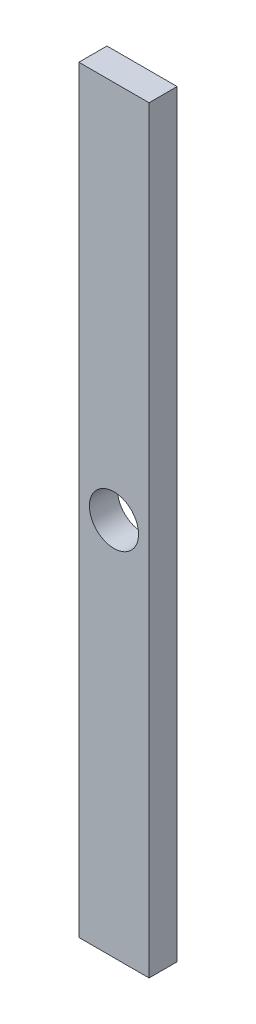
ISO-10303-21;
HEADER;
FILE_DESCRIPTION(('STEP AP214'),'2;1');
FILE_NAME('part.step','',(''),(''),'','','');
FILE_SCHEMA(('AUTOMOTIVE_DESIGN { 1 0 10303 214 1 1 1 1 }'));
ENDSEC;
DATA;
#1=APPLICATION_CONTEXT('core data for automotive mechanical design processes');
#2=APPLICATION_PROTOCOL_DEFINITION('international standard','automotive_design',2000,#1);
#3=PRODUCT_CONTEXT('',#1,'mechanical');
#4=PRODUCT('Part','Part','',(#3));
#5=PRODUCT_RELATED_PRODUCT_CATEGORY('part','',(#4));
#6=PRODUCT_DEFINITION_FORMATION('','',#4);
#7=PRODUCT_DEFINITION_CONTEXT('part definition',#1,'design');
#8=PRODUCT_DEFINITION('design','',#6,#7);
#9=PRODUCT_DEFINITION_SHAPE('','',#8);
#10=(LENGTH_UNIT() NAMED_UNIT(*) SI_UNIT(.MILLI.,.METRE.));
#11=(NAMED_UNIT(*) PLANE_ANGLE_UNIT() SI_UNIT($,.RADIAN.));
#12=(NAMED_UNIT(*) SI_UNIT($,.STERADIAN.) SOLID_ANGLE_UNIT());
#13=UNCERTAINTY_MEASURE_WITH_UNIT(LENGTH_MEASURE(1.E-05),#10,'distance_accuracy_value','');
#14=(GEOMETRIC_REPRESENTATION_CONTEXT(3) GLOBAL_UNCERTAINTY_ASSIGNED_CONTEXT((#13)) GLOBAL_UNIT_ASSIGNED_CONTEXT((#10,
#11,#12)) REPRESENTATION_CONTEXT('',''));
#15=CARTESIAN_POINT('',(0.,0.,0.));
#16=DIRECTION('',(0.,0.,1.));
#17=DIRECTION('',(1.,0.,0.));
#18=AXIS2_PLACEMENT_3D('',#15,#16,#17);
#19=CARTESIAN_POINT('',(2.5,27.,2.));
#20=DIRECTION('',(-1.,0.,0.));
#21=DIRECTION('',(0.,-1.,0.));
#22=AXIS2_PLACEMENT_3D('',#19,#20,#21);
#23=PLANE('',#22);
#24=DIRECTION('',(0.,1.,0.));
#25=VECTOR('',#24,1.);
#26=CARTESIAN_POINT('',(2.5,27.,0.));
#27=LINE('',#26,#25);
#28=CARTESIAN_POINT('',(2.5,-27.,0.));
#29=VERTEX_POINT('',#28);
#30=CARTESIAN_POINT('',(2.5,27.,0.));
#31=VERTEX_POINT('',#30);
#32=EDGE_CURVE('E98',#29,#31,#27,.T.);
#33=ORIENTED_EDGE('',*,*,#32,.T.);
#34=DIRECTION('',(0.,0.,-1.));
#35=VECTOR('',#34,1.);
#36=CARTESIAN_POINT('',(2.5,27.,2.));
#37=LINE('',#36,#35);
#38=CARTESIAN_POINT('',(2.5,27.,2.));
#39=VERTEX_POINT('',#38);
#40=EDGE_CURVE('E11',#39,#31,#37,.T.);
#41=ORIENTED_EDGE('',*,*,#40,.F.);
#42=DIRECTION('',(0.,1.,0.));
#43=VECTOR('',#42,1.);
#44=CARTESIAN_POINT('',(2.5,27.,2.));
#45=LINE('',#44,#43);
#46=CARTESIAN_POINT('',(2.5,-27.,2.));
#47=VERTEX_POINT('',#46);
#48=EDGE_CURVE('E85',#47,#39,#45,.T.);
#49=ORIENTED_EDGE('',*,*,#48,.F.);
#50=DIRECTION('',(0.,0.,-1.));
#51=VECTOR('',#50,1.);
#52=CARTESIAN_POINT('',(2.5,-27.,2.));
#53=LINE('',#52,#51);
#54=EDGE_CURVE('E94',#47,#29,#53,.T.);
#55=ORIENTED_EDGE('',*,*,#54,.T.);
#56=EDGE_LOOP('',(#33,#41,#49,#55));
#57=FACE_BOUND('',#56,.T.);
#58=ADVANCED_FACE('F33',(#57),#23,.F.);
#59=CARTESIAN_POINT('',(-2.5,27.,2.));
#60=DIRECTION('',(0.,-1.,0.));
#61=DIRECTION('',(0.,0.,-1.));
#62=AXIS2_PLACEMENT_3D('',#59,#60,#61);
#63=PLANE('',#62);
#64=DIRECTION('',(-1.,0.,0.));
#65=VECTOR('',#64,1.);
#66=CARTESIAN_POINT('',(-2.5,27.,0.));
#67=LINE('',#66,#65);
#68=CARTESIAN_POINT('',(-2.5,27.,0.));
#69=VERTEX_POINT('',#68);
#70=EDGE_CURVE('E89',#31,#69,#67,.T.);
#71=ORIENTED_EDGE('',*,*,#70,.T.);
#72=DIRECTION('',(0.,0.,-1.));
#73=VECTOR('',#72,1.);
#74=CARTESIAN_POINT('',(-2.5,27.,2.));
#75=LINE('',#74,#73);
#76=CARTESIAN_POINT('',(-2.5,27.,2.));
#77=VERTEX_POINT('',#76);
#78=EDGE_CURVE('E42',#77,#69,#75,.T.);
#79=ORIENTED_EDGE('',*,*,#78,.F.);
#80=DIRECTION('',(-1.,0.,0.));
#81=VECTOR('',#80,1.);
#82=CARTESIAN_POINT('',(-2.5,27.,2.));
#83=LINE('',#82,#81);
#84=EDGE_CURVE('E80',#39,#77,#83,.T.);
#85=ORIENTED_EDGE('',*,*,#84,.F.);
#86=ORIENTED_EDGE('',*,*,#40,.T.);
#87=EDGE_LOOP('',(#71,#79,#85,#86));
#88=FACE_BOUND('',#87,.T.);
#89=ADVANCED_FACE('F88',(#88),#63,.F.);
#90=CARTESIAN_POINT('',(-2.5,27.,2.));
#91=DIRECTION('',(1.,0.,0.));
#92=DIRECTION('',(0.,1.,0.));
#93=AXIS2_PLACEMENT_3D('',#90,#91,#92);
#94=PLANE('',#93);
#95=DIRECTION('',(0.,-1.,0.));
#96=VECTOR('',#95,1.);
#97=CARTESIAN_POINT('',(-2.5,27.,0.));
#98=LINE('',#97,#96);
#99=CARTESIAN_POINT('',(-2.5,-27.,0.));
#100=VERTEX_POINT('',#99);
#101=EDGE_CURVE('E67',#69,#100,#98,.T.);
#102=ORIENTED_EDGE('',*,*,#101,.T.);
#103=DIRECTION('',(0.,0.,-1.));
#104=VECTOR('',#103,1.);
#105=CARTESIAN_POINT('',(-2.5,-27.,2.));
#106=LINE('',#105,#104);
#107=CARTESIAN_POINT('',(-2.5,-27.,2.));
#108=VERTEX_POINT('',#107);
#109=EDGE_CURVE('E90',#108,#100,#106,.T.);
#110=ORIENTED_EDGE('',*,*,#109,.F.);
#111=DIRECTION('',(0.,-1.,0.));
#112=VECTOR('',#111,1.);
#113=CARTESIAN_POINT('',(-2.5,27.,2.));
#114=LINE('',#113,#112);
#115=EDGE_CURVE('E83',#77,#108,#114,.T.);
#116=ORIENTED_EDGE('',*,*,#115,.F.);
#117=ORIENTED_EDGE('',*,*,#78,.T.);
#118=EDGE_LOOP('',(#102,#110,#116,#117));
#119=FACE_BOUND('',#118,.T.);
#120=ADVANCED_FACE('F92',(#119),#94,.F.);
#121=CARTESIAN_POINT('',(-2.5,-27.,2.));
#122=DIRECTION('',(0.,1.,0.));
#123=DIRECTION('',(0.,0.,1.));
#124=AXIS2_PLACEMENT_3D('',#121,#122,#123);
#125=PLANE('',#124);
#126=DIRECTION('',(1.,0.,0.));
#127=VECTOR('',#126,1.);
#128=CARTESIAN_POINT('',(-2.5,-27.,0.));
#129=LINE('',#128,#127);
#130=EDGE_CURVE('E73',#100,#29,#129,.T.);
#131=ORIENTED_EDGE('',*,*,#130,.T.);
#132=ORIENTED_EDGE('',*,*,#54,.F.);
#133=DIRECTION('',(1.,0.,0.));
#134=VECTOR('',#133,1.);
#135=CARTESIAN_POINT('',(-2.5,-27.,2.));
#136=LINE('',#135,#134);
#137=EDGE_CURVE('E50',#108,#47,#136,.T.);
#138=ORIENTED_EDGE('',*,*,#137,.F.);
#139=ORIENTED_EDGE('',*,*,#109,.T.);
#140=EDGE_LOOP('',(#131,#132,#138,#139));
#141=FACE_BOUND('',#140,.T.);
#142=ADVANCED_FACE('F105',(#141),#125,.F.);
#143=CARTESIAN_POINT('',(0.,0.,2.));
#144=DIRECTION('',(0.,0.,1.));
#145=DIRECTION('',(1.,0.,0.));
#146=AXIS2_PLACEMENT_3D('',#143,#144,#145);
#147=PLANE('',#146);
#148=CARTESIAN_POINT('',(0.,0.,2.));
#149=DIRECTION('',(0.,0.,1.));
#150=DIRECTION('',(1.,0.,0.));
#151=AXIS2_PLACEMENT_3D('',#148,#149,#150);
#152=CIRCLE('',#151,1.75);
#153=CARTESIAN_POINT('',(1.75,0.,2.));
#154=VERTEX_POINT('',#153);
#155=EDGE_CURVE('E111',#154,#154,#152,.T.);
#156=ORIENTED_EDGE('',*,*,#155,.F.);
#157=EDGE_LOOP('',(#156));
#158=FACE_BOUND('',#157,.T.);
#159=ORIENTED_EDGE('',*,*,#48,.T.);
#160=ORIENTED_EDGE('',*,*,#84,.T.);
#161=ORIENTED_EDGE('',*,*,#115,.T.);
#162=ORIENTED_EDGE('',*,*,#137,.T.);
#163=EDGE_LOOP('',(#159,#160,#161,#162));
#164=FACE_BOUND('',#163,.T.);
#165=ADVANCED_FACE('F81',(#158,#164),#147,.T.);
#166=CARTESIAN_POINT('',(0.,0.,0.));
#167=DIRECTION('',(0.,0.,1.));
#168=DIRECTION('',(1.,0.,0.));
#169=AXIS2_PLACEMENT_3D('',#166,#167,#168);
#170=PLANE('',#169);
#171=CARTESIAN_POINT('',(0.,0.,0.));
#172=DIRECTION('',(0.,0.,1.));
#173=DIRECTION('',(1.,0.,0.));
#174=AXIS2_PLACEMENT_3D('',#171,#172,#173);
#175=CIRCLE('',#174,1.75);
#176=CARTESIAN_POINT('',(1.75,0.,0.));
#177=VERTEX_POINT('',#176);
#178=EDGE_CURVE('E36',#177,#177,#175,.T.);
#179=ORIENTED_EDGE('',*,*,#178,.T.);
#180=EDGE_LOOP('',(#179));
#181=FACE_BOUND('',#180,.T.);
#182=ORIENTED_EDGE('',*,*,#32,.F.);
#183=ORIENTED_EDGE('',*,*,#130,.F.);
#184=ORIENTED_EDGE('',*,*,#101,.F.);
#185=ORIENTED_EDGE('',*,*,#70,.F.);
#186=EDGE_LOOP('',(#182,#183,#184,#185));
#187=FACE_BOUND('',#186,.T.);
#188=ADVANCED_FACE('F108',(#181,#187),#170,.F.);
#189=CARTESIAN_POINT('',(0.,0.,-8.));
#190=DIRECTION('',(0.,0.,1.));
#191=DIRECTION('',(1.,0.,0.));
#192=AXIS2_PLACEMENT_3D('',#189,#190,#191);
#193=CYLINDRICAL_SURFACE('',#192,1.75);
#194=ORIENTED_EDGE('',*,*,#155,.T.);
#195=EDGE_LOOP('',(#194));
#196=FACE_BOUND('',#195,.T.);
#197=ORIENTED_EDGE('',*,*,#178,.F.);
#198=EDGE_LOOP('',(#197));
#199=FACE_BOUND('',#198,.T.);
#200=ADVANCED_FACE('F119',(#196,#199),#193,.F.);
#201=CLOSED_SHELL('',(#58,#89,#120,#142,#165,#188,#200));
#202=MANIFOLD_SOLID_BREP('B2',#201);
#203=ADVANCED_BREP_SHAPE_REPRESENTATION('',(#18,#202),#14);
#204=SHAPE_DEFINITION_REPRESENTATION(#9,#203);
ENDSEC;
END-ISO-10303-21;
